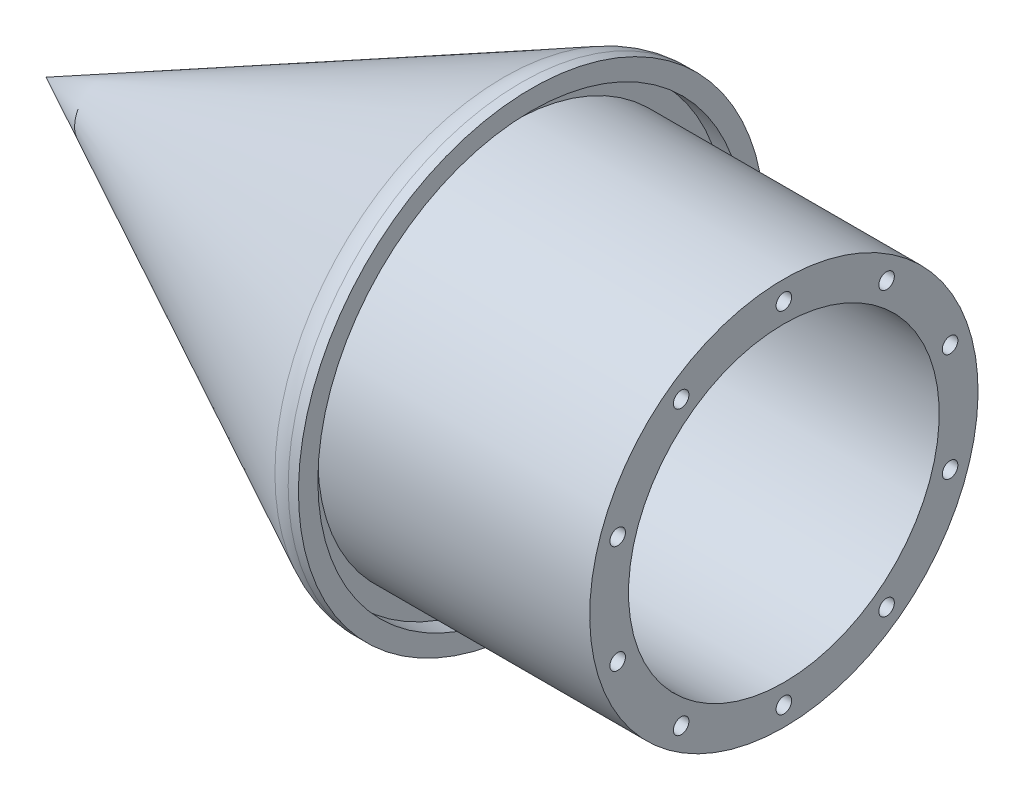
ISO-10303-21;
HEADER;
FILE_DESCRIPTION(('STEP AP214'),'2;1');
FILE_NAME('part.step','',(''),(''),'','','');
FILE_SCHEMA(('AUTOMOTIVE_DESIGN { 1 0 10303 214 1 1 1 1 }'));
ENDSEC;
DATA;
#1=APPLICATION_CONTEXT('core data for automotive mechanical design processes');
#2=APPLICATION_PROTOCOL_DEFINITION('international standard','automotive_design',2000,#1);
#3=PRODUCT_CONTEXT('',#1,'mechanical');
#4=PRODUCT('Part','Part','',(#3));
#5=PRODUCT_RELATED_PRODUCT_CATEGORY('part','',(#4));
#6=PRODUCT_DEFINITION_FORMATION('','',#4);
#7=PRODUCT_DEFINITION_CONTEXT('part definition',#1,'design');
#8=PRODUCT_DEFINITION('design','',#6,#7);
#9=PRODUCT_DEFINITION_SHAPE('','',#8);
#10=(LENGTH_UNIT() NAMED_UNIT(*) SI_UNIT(.MILLI.,.METRE.));
#11=(NAMED_UNIT(*) PLANE_ANGLE_UNIT() SI_UNIT($,.RADIAN.));
#12=(NAMED_UNIT(*) SI_UNIT($,.STERADIAN.) SOLID_ANGLE_UNIT());
#13=UNCERTAINTY_MEASURE_WITH_UNIT(LENGTH_MEASURE(1.E-05),#10,'distance_accuracy_value','');
#14=(GEOMETRIC_REPRESENTATION_CONTEXT(3) GLOBAL_UNCERTAINTY_ASSIGNED_CONTEXT((#13)) GLOBAL_UNIT_ASSIGNED_CONTEXT((#10,
#11,#12)) REPRESENTATION_CONTEXT('',''));
#15=CARTESIAN_POINT('',(0.,0.,0.));
#16=DIRECTION('',(0.,0.,1.));
#17=DIRECTION('',(1.,0.,0.));
#18=AXIS2_PLACEMENT_3D('',#15,#16,#17);
#19=CARTESIAN_POINT('',(-80.,0.,0.));
#20=DIRECTION('',(1.,0.,0.));
#21=DIRECTION('',(0.,1.,0.));
#22=AXIS2_PLACEMENT_3D('',#19,#20,#21);
#23=CONICAL_SURFACE('',#22,45.,0.463647609000806);
#24=CARTESIAN_POINT('',(-170.,0.,0.));
#25=VERTEX_POINT('',#24);
#26=VERTEX_LOOP('',#25);
#27=FACE_BOUND('',#26,.T.);
#28=CARTESIAN_POINT('',(-80.,0.,0.));
#29=DIRECTION('',(-1.,0.,0.));
#30=DIRECTION('',(0.,-1.,0.));
#31=AXIS2_PLACEMENT_3D('',#28,#29,#30);
#32=CIRCLE('',#31,45.);
#33=CARTESIAN_POINT('',(-80.,-45.,0.));
#34=VERTEX_POINT('',#33);
#35=EDGE_CURVE('E64',#34,#34,#32,.T.);
#36=ORIENTED_EDGE('',*,*,#35,.F.);
#37=EDGE_LOOP('',(#36));
#38=FACE_BOUND('',#37,.T.);
#39=ADVANCED_FACE('F44',(#27,#38),#23,.F.);
#40=CARTESIAN_POINT('',(-80.,2.22044604925032E-13,0.));
#41=DIRECTION('',(-1.,0.,0.));
#42=DIRECTION('',(0.,-1.,0.));
#43=AXIS2_PLACEMENT_3D('',#40,#41,#42);
#44=PLANE('',#43);
#45=ORIENTED_EDGE('',*,*,#35,.T.);
#46=EDGE_LOOP('',(#45));
#47=FACE_BOUND('',#46,.T.);
#48=CARTESIAN_POINT('',(-80.,0.,0.));
#49=DIRECTION('',(-1.,0.,0.));
#50=DIRECTION('',(0.,-1.,0.));
#51=AXIS2_PLACEMENT_3D('',#48,#49,#50);
#52=CIRCLE('',#51,40.);
#53=CARTESIAN_POINT('',(-80.,-40.,0.));
#54=VERTEX_POINT('',#53);
#55=EDGE_CURVE('E67',#54,#54,#52,.T.);
#56=ORIENTED_EDGE('',*,*,#55,.F.);
#57=EDGE_LOOP('',(#56));
#58=FACE_BOUND('',#57,.T.);
#59=ADVANCED_FACE('F61',(#47,#58),#44,.T.);
#60=CARTESIAN_POINT('',(-170.,0.,0.));
#61=DIRECTION('',(-1.,0.,0.));
#62=DIRECTION('',(0.,-1.,0.));
#63=AXIS2_PLACEMENT_3D('',#60,#61,#62);
#64=CYLINDRICAL_SURFACE('',#63,40.);
#65=ORIENTED_EDGE('',*,*,#55,.T.);
#66=EDGE_LOOP('',(#65));
#67=FACE_BOUND('',#66,.T.);
#68=CARTESIAN_POINT('',(0.,0.,0.));
#69=DIRECTION('',(-1.,0.,0.));
#70=DIRECTION('',(0.,-1.,0.));
#71=AXIS2_PLACEMENT_3D('',#68,#69,#70);
#72=CIRCLE('',#71,40.);
#73=CARTESIAN_POINT('',(0.,-40.,0.));
#74=VERTEX_POINT('',#73);
#75=EDGE_CURVE('E73',#74,#74,#72,.T.);
#76=ORIENTED_EDGE('',*,*,#75,.F.);
#77=EDGE_LOOP('',(#76));
#78=FACE_BOUND('',#77,.T.);
#79=ADVANCED_FACE('F193',(#67,#78),#64,.F.);
#80=CARTESIAN_POINT('',(0.,0.,0.));
#81=DIRECTION('',(1.,0.,0.));
#82=DIRECTION('',(0.,1.,0.));
#83=AXIS2_PLACEMENT_3D('',#80,#81,#82);
#84=PLANE('',#83);
#85=CARTESIAN_POINT('',(0.,45.,0.));
#86=DIRECTION('',(1.,0.,0.));
#87=DIRECTION('',(0.,1.,0.));
#88=AXIS2_PLACEMENT_3D('',#85,#86,#87);
#89=CIRCLE('',#88,2.);
#90=CARTESIAN_POINT('',(0.,47.,0.));
#91=VERTEX_POINT('',#90);
#92=EDGE_CURVE('E165',#91,#91,#89,.T.);
#93=ORIENTED_EDGE('',*,*,#92,.F.);
#94=EDGE_LOOP('',(#93));
#95=FACE_BOUND('',#94,.T.);
#96=CARTESIAN_POINT('',(0.,36.405764746873,26.4503363531608));
#97=DIRECTION('',(1.,0.,0.));
#98=DIRECTION('',(0.,1.,0.));
#99=AXIS2_PLACEMENT_3D('',#96,#97,#98);
#100=CIRCLE('',#99,2.);
#101=CARTESIAN_POINT('',(0.,38.405764746873,26.4503363531608));
#102=VERTEX_POINT('',#101);
#103=EDGE_CURVE('E105',#102,#102,#100,.T.);
#104=ORIENTED_EDGE('',*,*,#103,.F.);
#105=EDGE_LOOP('',(#104));
#106=FACE_BOUND('',#105,.T.);
#107=CARTESIAN_POINT('',(0.,13.9057647468731,42.7975432332818));
#108=DIRECTION('',(1.,0.,0.));
#109=DIRECTION('',(0.,1.,0.));
#110=AXIS2_PLACEMENT_3D('',#107,#108,#109);
#111=CIRCLE('',#110,2.);
#112=CARTESIAN_POINT('',(0.,15.9057647468731,42.7975432332818));
#113=VERTEX_POINT('',#112);
#114=EDGE_CURVE('E104',#113,#113,#111,.T.);
#115=ORIENTED_EDGE('',*,*,#114,.F.);
#116=EDGE_LOOP('',(#115));
#117=FACE_BOUND('',#116,.T.);
#118=CARTESIAN_POINT('',(0.,-13.9057647468722,42.797543233282));
#119=DIRECTION('',(1.,0.,0.));
#120=DIRECTION('',(0.,1.,0.));
#121=AXIS2_PLACEMENT_3D('',#118,#119,#120);
#122=CIRCLE('',#121,2.);
#123=CARTESIAN_POINT('',(0.,-11.9057647468722,42.797543233282));
#124=VERTEX_POINT('',#123);
#125=EDGE_CURVE('E113',#124,#124,#122,.T.);
#126=ORIENTED_EDGE('',*,*,#125,.F.);
#127=EDGE_LOOP('',(#126));
#128=FACE_BOUND('',#127,.T.);
#129=CARTESIAN_POINT('',(0.,-36.4057647468724,26.4503363531616));
#130=DIRECTION('',(1.,0.,0.));
#131=DIRECTION('',(0.,1.,0.));
#132=AXIS2_PLACEMENT_3D('',#129,#130,#131);
#133=CIRCLE('',#132,2.);
#134=CARTESIAN_POINT('',(0.,-34.4057647468724,26.4503363531616));
#135=VERTEX_POINT('',#134);
#136=EDGE_CURVE('E121',#135,#135,#133,.T.);
#137=ORIENTED_EDGE('',*,*,#136,.F.);
#138=EDGE_LOOP('',(#137));
#139=FACE_BOUND('',#138,.T.);
#140=CARTESIAN_POINT('',(0.,-45.,3.14233320495882E-13));
#141=DIRECTION('',(1.,0.,0.));
#142=DIRECTION('',(0.,1.,0.));
#143=AXIS2_PLACEMENT_3D('',#140,#141,#142);
#144=CIRCLE('',#143,2.);
#145=CARTESIAN_POINT('',(0.,-43.,3.14233320495882E-13));
#146=VERTEX_POINT('',#145);
#147=EDGE_CURVE('E129',#146,#146,#144,.T.);
#148=ORIENTED_EDGE('',*,*,#147,.F.);
#149=EDGE_LOOP('',(#148));
#150=FACE_BOUND('',#149,.T.);
#151=CARTESIAN_POINT('',(0.,-36.4057647468728,-26.4503363531611));
#152=DIRECTION('',(1.,0.,0.));
#153=DIRECTION('',(0.,1.,0.));
#154=AXIS2_PLACEMENT_3D('',#151,#152,#153);
#155=CIRCLE('',#154,2.);
#156=CARTESIAN_POINT('',(0.,-34.4057647468728,-26.4503363531611));
#157=VERTEX_POINT('',#156);
#158=EDGE_CURVE('E137',#157,#157,#155,.T.);
#159=ORIENTED_EDGE('',*,*,#158,.F.);
#160=EDGE_LOOP('',(#159));
#161=FACE_BOUND('',#160,.T.);
#162=CARTESIAN_POINT('',(0.,-13.9057647468728,-42.7975432332819));
#163=DIRECTION('',(1.,0.,0.));
#164=DIRECTION('',(0.,1.,0.));
#165=AXIS2_PLACEMENT_3D('',#162,#163,#164);
#166=CIRCLE('',#165,2.);
#167=CARTESIAN_POINT('',(0.,-11.9057647468728,-42.7975432332819));
#168=VERTEX_POINT('',#167);
#169=EDGE_CURVE('E145',#168,#168,#166,.T.);
#170=ORIENTED_EDGE('',*,*,#169,.F.);
#171=EDGE_LOOP('',(#170));
#172=FACE_BOUND('',#171,.T.);
#173=CARTESIAN_POINT('',(0.,13.9057647468725,-42.797543233282));
#174=DIRECTION('',(1.,0.,0.));
#175=DIRECTION('',(0.,1.,0.));
#176=AXIS2_PLACEMENT_3D('',#173,#174,#175);
#177=CIRCLE('',#176,2.);
#178=CARTESIAN_POINT('',(0.,15.9057647468725,-42.797543233282));
#179=VERTEX_POINT('',#178);
#180=EDGE_CURVE('E153',#179,#179,#177,.T.);
#181=ORIENTED_EDGE('',*,*,#180,.F.);
#182=EDGE_LOOP('',(#181));
#183=FACE_BOUND('',#182,.T.);
#184=CARTESIAN_POINT('',(0.,36.4057647468726,-26.4503363531613));
#185=DIRECTION('',(1.,0.,0.));
#186=DIRECTION('',(0.,1.,0.));
#187=AXIS2_PLACEMENT_3D('',#184,#185,#186);
#188=CIRCLE('',#187,2.);
#189=CARTESIAN_POINT('',(0.,38.4057647468726,-26.4503363531613));
#190=VERTEX_POINT('',#189);
#191=EDGE_CURVE('E161',#190,#190,#188,.T.);
#192=ORIENTED_EDGE('',*,*,#191,.F.);
#193=EDGE_LOOP('',(#192));
#194=FACE_BOUND('',#193,.T.);
#195=ORIENTED_EDGE('',*,*,#75,.T.);
#196=EDGE_LOOP('',(#195));
#197=FACE_BOUND('',#196,.T.);
#198=CARTESIAN_POINT('',(0.,0.,0.));
#199=DIRECTION('',(-1.,0.,0.));
#200=DIRECTION('',(0.,-1.,0.));
#201=AXIS2_PLACEMENT_3D('',#198,#199,#200);
#202=CIRCLE('',#201,50.);
#203=CARTESIAN_POINT('',(0.,-50.,0.));
#204=VERTEX_POINT('',#203);
#205=EDGE_CURVE('E79',#204,#204,#202,.T.);
#206=ORIENTED_EDGE('',*,*,#205,.F.);
#207=EDGE_LOOP('',(#206));
#208=FACE_BOUND('',#207,.T.);
#209=ADVANCED_FACE('F189',(#95,#106,#117,#128,#139,#150,#161,#172,#183,#194,#197,#208),#84,.T.);
#210=CARTESIAN_POINT('',(-170.,0.,0.));
#211=DIRECTION('',(-1.,0.,0.));
#212=DIRECTION('',(0.,-1.,0.));
#213=AXIS2_PLACEMENT_3D('',#210,#211,#212);
#214=CYLINDRICAL_SURFACE('',#213,50.);
#215=CARTESIAN_POINT('',(-70.,0.,0.));
#216=DIRECTION('',(-1.,0.,0.));
#217=DIRECTION('',(0.,-1.,0.));
#218=AXIS2_PLACEMENT_3D('',#215,#216,#217);
#219=CIRCLE('',#218,50.);
#220=CARTESIAN_POINT('',(-70.,-50.,0.));
#221=VERTEX_POINT('',#220);
#222=EDGE_CURVE('E83',#221,#221,#219,.T.);
#223=ORIENTED_EDGE('',*,*,#222,.F.);
#224=EDGE_LOOP('',(#223));
#225=FACE_BOUND('',#224,.T.);
#226=ORIENTED_EDGE('',*,*,#205,.T.);
#227=EDGE_LOOP('',(#226));
#228=FACE_BOUND('',#227,.T.);
#229=ADVANCED_FACE('F192',(#225,#228),#214,.T.);
#230=CARTESIAN_POINT('',(-70.,-1.94289029309402E-13,0.));
#231=DIRECTION('',(-1.,0.,0.));
#232=DIRECTION('',(0.,-1.,0.));
#233=AXIS2_PLACEMENT_3D('',#230,#231,#232);
#234=PLANE('',#233);
#235=CARTESIAN_POINT('',(-70.,0.,0.));
#236=DIRECTION('',(-1.,0.,0.));
#237=DIRECTION('',(0.,-1.,0.));
#238=AXIS2_PLACEMENT_3D('',#235,#236,#237);
#239=CIRCLE('',#238,55.);
#240=CARTESIAN_POINT('',(-70.,-55.,0.));
#241=VERTEX_POINT('',#240);
#242=EDGE_CURVE('E87',#241,#241,#239,.T.);
#243=ORIENTED_EDGE('',*,*,#242,.F.);
#244=EDGE_LOOP('',(#243));
#245=FACE_BOUND('',#244,.T.);
#246=ORIENTED_EDGE('',*,*,#222,.T.);
#247=EDGE_LOOP('',(#246));
#248=FACE_BOUND('',#247,.T.);
#249=ADVANCED_FACE('F218',(#245,#248),#234,.F.);
#250=CARTESIAN_POINT('',(-170.,0.,0.));
#251=DIRECTION('',(-1.,0.,0.));
#252=DIRECTION('',(0.,-1.,0.));
#253=AXIS2_PLACEMENT_3D('',#250,#251,#252);
#254=CYLINDRICAL_SURFACE('',#253,55.);
#255=CARTESIAN_POINT('',(-65.,0.,0.));
#256=DIRECTION('',(-1.,0.,0.));
#257=DIRECTION('',(0.,-1.,0.));
#258=AXIS2_PLACEMENT_3D('',#255,#256,#257);
#259=CIRCLE('',#258,55.);
#260=CARTESIAN_POINT('',(-65.,-55.,0.));
#261=VERTEX_POINT('',#260);
#262=EDGE_CURVE('E91',#261,#261,#259,.T.);
#263=ORIENTED_EDGE('',*,*,#262,.F.);
#264=EDGE_LOOP('',(#263));
#265=FACE_BOUND('',#264,.T.);
#266=ORIENTED_EDGE('',*,*,#242,.T.);
#267=EDGE_LOOP('',(#266));
#268=FACE_BOUND('',#267,.T.);
#269=ADVANCED_FACE('F224',(#265,#268),#254,.F.);
#270=CARTESIAN_POINT('',(-65.,0.,0.));
#271=DIRECTION('',(-1.,0.,0.));
#272=DIRECTION('',(0.,-1.,0.));
#273=AXIS2_PLACEMENT_3D('',#270,#271,#272);
#274=PLANE('',#273);
#275=CARTESIAN_POINT('',(-65.,0.,0.));
#276=DIRECTION('',(-1.,0.,0.));
#277=DIRECTION('',(0.,-1.,0.));
#278=AXIS2_PLACEMENT_3D('',#275,#276,#277);
#279=CIRCLE('',#278,60.);
#280=CARTESIAN_POINT('',(-65.,-60.,0.));
#281=VERTEX_POINT('',#280);
#282=EDGE_CURVE('E95',#281,#281,#279,.T.);
#283=ORIENTED_EDGE('',*,*,#282,.F.);
#284=EDGE_LOOP('',(#283));
#285=FACE_BOUND('',#284,.T.);
#286=ORIENTED_EDGE('',*,*,#262,.T.);
#287=EDGE_LOOP('',(#286));
#288=FACE_BOUND('',#287,.T.);
#289=ADVANCED_FACE('F257',(#285,#288),#274,.F.);
#290=CARTESIAN_POINT('',(-170.,0.,0.));
#291=DIRECTION('',(-1.,0.,0.));
#292=DIRECTION('',(0.,-1.,0.));
#293=AXIS2_PLACEMENT_3D('',#290,#291,#292);
#294=CYLINDRICAL_SURFACE('',#293,60.);
#295=CARTESIAN_POINT('',(-67.6393202250021,0.,0.));
#296=DIRECTION('',(1.,0.,0.));
#297=DIRECTION('',(0.,1.,0.));
#298=AXIS2_PLACEMENT_3D('',#295,#296,#297);
#299=CIRCLE('',#298,60.);
#300=CARTESIAN_POINT('',(-67.6393202250021,60.,0.));
#301=VERTEX_POINT('',#300);
#302=EDGE_CURVE('E11',#301,#301,#299,.T.);
#303=ORIENTED_EDGE('',*,*,#302,.T.);
#304=EDGE_LOOP('',(#303));
#305=FACE_BOUND('',#304,.T.);
#306=ORIENTED_EDGE('',*,*,#282,.T.);
#307=EDGE_LOOP('',(#306));
#308=FACE_BOUND('',#307,.T.);
#309=ADVANCED_FACE('F480',(#305,#308),#294,.T.);
#310=CARTESIAN_POINT('',(-70.,0.,0.));
#311=DIRECTION('',(1.,0.,0.));
#312=DIRECTION('',(0.,1.,0.));
#313=AXIS2_PLACEMENT_3D('',#310,#311,#312);
#314=CONICAL_SURFACE('',#313,60.,0.463647609000806);
#315=CARTESIAN_POINT('',(-72.1114561800017,0.,0.));
#316=DIRECTION('',(-1.,0.,0.));
#317=DIRECTION('',(0.,-1.,0.));
#318=AXIS2_PLACEMENT_3D('',#315,#316,#317);
#319=CIRCLE('',#318,58.9442719099992);
#320=CARTESIAN_POINT('',(-72.1114561800017,-58.9442719099992,0.));
#321=VERTEX_POINT('',#320);
#322=EDGE_CURVE('E53',#321,#321,#319,.T.);
#323=ORIENTED_EDGE('',*,*,#322,.T.);
#324=EDGE_LOOP('',(#323));
#325=FACE_BOUND('',#324,.T.);
#326=CARTESIAN_POINT('',(-190.,0.,0.));
#327=VERTEX_POINT('',#326);
#328=VERTEX_LOOP('',#327);
#329=FACE_BOUND('',#328,.T.);
#330=ADVANCED_FACE('F268',(#325,#329),#314,.T.);
#331=CARTESIAN_POINT('',(-20.,36.4057647468726,-26.4503363531613));
#332=DIRECTION('',(1.,0.,0.));
#333=DIRECTION('',(0.,1.,0.));
#334=AXIS2_PLACEMENT_3D('',#331,#332,#333);
#335=CYLINDRICAL_SURFACE('',#334,2.);
#336=CARTESIAN_POINT('',(-20.,36.4057647468726,-26.4503363531613));
#337=DIRECTION('',(1.,0.,0.));
#338=DIRECTION('',(0.,1.,0.));
#339=AXIS2_PLACEMENT_3D('',#336,#337,#338);
#340=CIRCLE('',#339,2.);
#341=CARTESIAN_POINT('',(-20.,38.4057647468726,-26.4503363531613));
#342=VERTEX_POINT('',#341);
#343=EDGE_CURVE('E157',#342,#342,#340,.T.);
#344=ORIENTED_EDGE('',*,*,#343,.F.);
#345=EDGE_LOOP('',(#344));
#346=FACE_BOUND('',#345,.T.);
#347=ORIENTED_EDGE('',*,*,#191,.T.);
#348=EDGE_LOOP('',(#347));
#349=FACE_BOUND('',#348,.T.);
#350=ADVANCED_FACE('F262',(#346,#349),#335,.F.);
#351=CARTESIAN_POINT('',(-20.,36.4057647468726,-26.4503363531613));
#352=DIRECTION('',(1.,0.,0.));
#353=DIRECTION('',(0.,1.,0.));
#354=AXIS2_PLACEMENT_3D('',#351,#352,#353);
#355=PLANE('',#354);
#356=ORIENTED_EDGE('',*,*,#343,.T.);
#357=EDGE_LOOP('',(#356));
#358=FACE_BOUND('',#357,.T.);
#359=ADVANCED_FACE('F267',(#358),#355,.T.);
#360=CARTESIAN_POINT('',(-20.,13.9057647468725,-42.797543233282));
#361=DIRECTION('',(1.,0.,0.));
#362=DIRECTION('',(0.,1.,0.));
#363=AXIS2_PLACEMENT_3D('',#360,#361,#362);
#364=CYLINDRICAL_SURFACE('',#363,2.);
#365=CARTESIAN_POINT('',(-20.,13.9057647468725,-42.797543233282));
#366=DIRECTION('',(1.,0.,0.));
#367=DIRECTION('',(0.,1.,0.));
#368=AXIS2_PLACEMENT_3D('',#365,#366,#367);
#369=CIRCLE('',#368,2.);
#370=CARTESIAN_POINT('',(-20.,15.9057647468725,-42.797543233282));
#371=VERTEX_POINT('',#370);
#372=EDGE_CURVE('E149',#371,#371,#369,.T.);
#373=ORIENTED_EDGE('',*,*,#372,.F.);
#374=EDGE_LOOP('',(#373));
#375=FACE_BOUND('',#374,.T.);
#376=ORIENTED_EDGE('',*,*,#180,.T.);
#377=EDGE_LOOP('',(#376));
#378=FACE_BOUND('',#377,.T.);
#379=ADVANCED_FACE('F281',(#375,#378),#364,.F.);
#380=CARTESIAN_POINT('',(-20.,13.9057647468725,-42.797543233282));
#381=DIRECTION('',(1.,0.,0.));
#382=DIRECTION('',(0.,1.,0.));
#383=AXIS2_PLACEMENT_3D('',#380,#381,#382);
#384=PLANE('',#383);
#385=ORIENTED_EDGE('',*,*,#372,.T.);
#386=EDGE_LOOP('',(#385));
#387=FACE_BOUND('',#386,.T.);
#388=ADVANCED_FACE('F292',(#387),#384,.T.);
#389=CARTESIAN_POINT('',(-20.,-13.9057647468728,-42.7975432332819));
#390=DIRECTION('',(1.,0.,0.));
#391=DIRECTION('',(0.,1.,0.));
#392=AXIS2_PLACEMENT_3D('',#389,#390,#391);
#393=CYLINDRICAL_SURFACE('',#392,2.);
#394=CARTESIAN_POINT('',(-20.,-13.9057647468728,-42.7975432332819));
#395=DIRECTION('',(1.,0.,0.));
#396=DIRECTION('',(0.,1.,0.));
#397=AXIS2_PLACEMENT_3D('',#394,#395,#396);
#398=CIRCLE('',#397,2.);
#399=CARTESIAN_POINT('',(-20.,-11.9057647468728,-42.7975432332819));
#400=VERTEX_POINT('',#399);
#401=EDGE_CURVE('E141',#400,#400,#398,.T.);
#402=ORIENTED_EDGE('',*,*,#401,.F.);
#403=EDGE_LOOP('',(#402));
#404=FACE_BOUND('',#403,.T.);
#405=ORIENTED_EDGE('',*,*,#169,.T.);
#406=EDGE_LOOP('',(#405));
#407=FACE_BOUND('',#406,.T.);
#408=ADVANCED_FACE('F303',(#404,#407),#393,.F.);
#409=CARTESIAN_POINT('',(-20.,-13.9057647468728,-42.7975432332819));
#410=DIRECTION('',(1.,0.,0.));
#411=DIRECTION('',(0.,1.,0.));
#412=AXIS2_PLACEMENT_3D('',#409,#410,#411);
#413=PLANE('',#412);
#414=ORIENTED_EDGE('',*,*,#401,.T.);
#415=EDGE_LOOP('',(#414));
#416=FACE_BOUND('',#415,.T.);
#417=ADVANCED_FACE('F314',(#416),#413,.T.);
#418=CARTESIAN_POINT('',(-20.,-36.4057647468728,-26.4503363531611));
#419=DIRECTION('',(1.,0.,0.));
#420=DIRECTION('',(0.,1.,0.));
#421=AXIS2_PLACEMENT_3D('',#418,#419,#420);
#422=CYLINDRICAL_SURFACE('',#421,2.);
#423=CARTESIAN_POINT('',(-20.,-36.4057647468728,-26.4503363531611));
#424=DIRECTION('',(1.,0.,0.));
#425=DIRECTION('',(0.,1.,0.));
#426=AXIS2_PLACEMENT_3D('',#423,#424,#425);
#427=CIRCLE('',#426,2.);
#428=CARTESIAN_POINT('',(-20.,-34.4057647468728,-26.4503363531611));
#429=VERTEX_POINT('',#428);
#430=EDGE_CURVE('E133',#429,#429,#427,.T.);
#431=ORIENTED_EDGE('',*,*,#430,.F.);
#432=EDGE_LOOP('',(#431));
#433=FACE_BOUND('',#432,.T.);
#434=ORIENTED_EDGE('',*,*,#158,.T.);
#435=EDGE_LOOP('',(#434));
#436=FACE_BOUND('',#435,.T.);
#437=ADVANCED_FACE('F325',(#433,#436),#422,.F.);
#438=CARTESIAN_POINT('',(-20.,-36.4057647468728,-26.4503363531611));
#439=DIRECTION('',(1.,0.,0.));
#440=DIRECTION('',(0.,1.,0.));
#441=AXIS2_PLACEMENT_3D('',#438,#439,#440);
#442=PLANE('',#441);
#443=ORIENTED_EDGE('',*,*,#430,.T.);
#444=EDGE_LOOP('',(#443));
#445=FACE_BOUND('',#444,.T.);
#446=ADVANCED_FACE('F336',(#445),#442,.T.);
#447=CARTESIAN_POINT('',(-20.,-45.,3.14233320495882E-13));
#448=DIRECTION('',(1.,0.,0.));
#449=DIRECTION('',(0.,1.,0.));
#450=AXIS2_PLACEMENT_3D('',#447,#448,#449);
#451=CYLINDRICAL_SURFACE('',#450,2.);
#452=CARTESIAN_POINT('',(-20.,-45.,3.14233320495882E-13));
#453=DIRECTION('',(1.,0.,0.));
#454=DIRECTION('',(0.,1.,0.));
#455=AXIS2_PLACEMENT_3D('',#452,#453,#454);
#456=CIRCLE('',#455,2.);
#457=CARTESIAN_POINT('',(-20.,-43.,3.14233320495882E-13));
#458=VERTEX_POINT('',#457);
#459=EDGE_CURVE('E125',#458,#458,#456,.T.);
#460=ORIENTED_EDGE('',*,*,#459,.F.);
#461=EDGE_LOOP('',(#460));
#462=FACE_BOUND('',#461,.T.);
#463=ORIENTED_EDGE('',*,*,#147,.T.);
#464=EDGE_LOOP('',(#463));
#465=FACE_BOUND('',#464,.T.);
#466=ADVANCED_FACE('F347',(#462,#465),#451,.F.);
#467=CARTESIAN_POINT('',(-20.,-45.,3.14233320495882E-13));
#468=DIRECTION('',(1.,0.,0.));
#469=DIRECTION('',(0.,1.,0.));
#470=AXIS2_PLACEMENT_3D('',#467,#468,#469);
#471=PLANE('',#470);
#472=ORIENTED_EDGE('',*,*,#459,.T.);
#473=EDGE_LOOP('',(#472));
#474=FACE_BOUND('',#473,.T.);
#475=ADVANCED_FACE('F358',(#474),#471,.T.);
#476=CARTESIAN_POINT('',(-20.,-36.4057647468724,26.4503363531616));
#477=DIRECTION('',(1.,0.,0.));
#478=DIRECTION('',(0.,1.,0.));
#479=AXIS2_PLACEMENT_3D('',#476,#477,#478);
#480=CYLINDRICAL_SURFACE('',#479,2.);
#481=CARTESIAN_POINT('',(-20.,-36.4057647468724,26.4503363531616));
#482=DIRECTION('',(1.,0.,0.));
#483=DIRECTION('',(0.,1.,0.));
#484=AXIS2_PLACEMENT_3D('',#481,#482,#483);
#485=CIRCLE('',#484,2.);
#486=CARTESIAN_POINT('',(-20.,-34.4057647468724,26.4503363531616));
#487=VERTEX_POINT('',#486);
#488=EDGE_CURVE('E117',#487,#487,#485,.T.);
#489=ORIENTED_EDGE('',*,*,#488,.F.);
#490=EDGE_LOOP('',(#489));
#491=FACE_BOUND('',#490,.T.);
#492=ORIENTED_EDGE('',*,*,#136,.T.);
#493=EDGE_LOOP('',(#492));
#494=FACE_BOUND('',#493,.T.);
#495=ADVANCED_FACE('F369',(#491,#494),#480,.F.);
#496=CARTESIAN_POINT('',(-20.,-36.4057647468724,26.4503363531616));
#497=DIRECTION('',(1.,0.,0.));
#498=DIRECTION('',(0.,1.,0.));
#499=AXIS2_PLACEMENT_3D('',#496,#497,#498);
#500=PLANE('',#499);
#501=ORIENTED_EDGE('',*,*,#488,.T.);
#502=EDGE_LOOP('',(#501));
#503=FACE_BOUND('',#502,.T.);
#504=ADVANCED_FACE('F380',(#503),#500,.T.);
#505=CARTESIAN_POINT('',(-20.,-13.9057647468722,42.797543233282));
#506=DIRECTION('',(1.,0.,0.));
#507=DIRECTION('',(0.,1.,0.));
#508=AXIS2_PLACEMENT_3D('',#505,#506,#507);
#509=CYLINDRICAL_SURFACE('',#508,2.);
#510=CARTESIAN_POINT('',(-20.,-13.9057647468722,42.797543233282));
#511=DIRECTION('',(1.,0.,0.));
#512=DIRECTION('',(0.,1.,0.));
#513=AXIS2_PLACEMENT_3D('',#510,#511,#512);
#514=CIRCLE('',#513,2.);
#515=CARTESIAN_POINT('',(-20.,-11.9057647468722,42.797543233282));
#516=VERTEX_POINT('',#515);
#517=EDGE_CURVE('E109',#516,#516,#514,.T.);
#518=ORIENTED_EDGE('',*,*,#517,.F.);
#519=EDGE_LOOP('',(#518));
#520=FACE_BOUND('',#519,.T.);
#521=ORIENTED_EDGE('',*,*,#125,.T.);
#522=EDGE_LOOP('',(#521));
#523=FACE_BOUND('',#522,.T.);
#524=ADVANCED_FACE('F391',(#520,#523),#509,.F.);
#525=CARTESIAN_POINT('',(-20.,-13.9057647468722,42.797543233282));
#526=DIRECTION('',(1.,0.,0.));
#527=DIRECTION('',(0.,1.,0.));
#528=AXIS2_PLACEMENT_3D('',#525,#526,#527);
#529=PLANE('',#528);
#530=ORIENTED_EDGE('',*,*,#517,.T.);
#531=EDGE_LOOP('',(#530));
#532=FACE_BOUND('',#531,.T.);
#533=ADVANCED_FACE('F402',(#532),#529,.T.);
#534=CARTESIAN_POINT('',(-20.,13.9057647468731,42.7975432332818));
#535=DIRECTION('',(1.,0.,0.));
#536=DIRECTION('',(0.,1.,0.));
#537=AXIS2_PLACEMENT_3D('',#534,#535,#536);
#538=CYLINDRICAL_SURFACE('',#537,2.);
#539=CARTESIAN_POINT('',(-20.,13.9057647468731,42.7975432332818));
#540=DIRECTION('',(1.,0.,0.));
#541=DIRECTION('',(0.,1.,0.));
#542=AXIS2_PLACEMENT_3D('',#539,#540,#541);
#543=CIRCLE('',#542,2.);
#544=CARTESIAN_POINT('',(-20.,15.9057647468731,42.7975432332818));
#545=VERTEX_POINT('',#544);
#546=EDGE_CURVE('E100',#545,#545,#543,.T.);
#547=ORIENTED_EDGE('',*,*,#546,.F.);
#548=EDGE_LOOP('',(#547));
#549=FACE_BOUND('',#548,.T.);
#550=ORIENTED_EDGE('',*,*,#114,.T.);
#551=EDGE_LOOP('',(#550));
#552=FACE_BOUND('',#551,.T.);
#553=ADVANCED_FACE('F413',(#549,#552),#538,.F.);
#554=CARTESIAN_POINT('',(-20.,13.9057647468731,42.7975432332818));
#555=DIRECTION('',(1.,0.,0.));
#556=DIRECTION('',(0.,1.,0.));
#557=AXIS2_PLACEMENT_3D('',#554,#555,#556);
#558=PLANE('',#557);
#559=ORIENTED_EDGE('',*,*,#546,.T.);
#560=EDGE_LOOP('',(#559));
#561=FACE_BOUND('',#560,.T.);
#562=ADVANCED_FACE('F424',(#561),#558,.T.);
#563=CARTESIAN_POINT('',(-20.,36.405764746873,26.4503363531608));
#564=DIRECTION('',(1.,0.,0.));
#565=DIRECTION('',(0.,1.,0.));
#566=AXIS2_PLACEMENT_3D('',#563,#564,#565);
#567=CYLINDRICAL_SURFACE('',#566,2.);
#568=CARTESIAN_POINT('',(-20.,36.405764746873,26.4503363531608));
#569=DIRECTION('',(1.,0.,0.));
#570=DIRECTION('',(0.,1.,0.));
#571=AXIS2_PLACEMENT_3D('',#568,#569,#570);
#572=CIRCLE('',#571,2.);
#573=CARTESIAN_POINT('',(-20.,38.405764746873,26.4503363531608));
#574=VERTEX_POINT('',#573);
#575=EDGE_CURVE('E166',#574,#574,#572,.T.);
#576=ORIENTED_EDGE('',*,*,#575,.F.);
#577=EDGE_LOOP('',(#576));
#578=FACE_BOUND('',#577,.T.);
#579=ORIENTED_EDGE('',*,*,#103,.T.);
#580=EDGE_LOOP('',(#579));
#581=FACE_BOUND('',#580,.T.);
#582=ADVANCED_FACE('F435',(#578,#581),#567,.F.);
#583=CARTESIAN_POINT('',(-20.,36.405764746873,26.4503363531608));
#584=DIRECTION('',(1.,0.,0.));
#585=DIRECTION('',(0.,1.,0.));
#586=AXIS2_PLACEMENT_3D('',#583,#584,#585);
#587=PLANE('',#586);
#588=ORIENTED_EDGE('',*,*,#575,.T.);
#589=EDGE_LOOP('',(#588));
#590=FACE_BOUND('',#589,.T.);
#591=ADVANCED_FACE('F185',(#590),#587,.T.);
#592=CARTESIAN_POINT('',(-20.,45.,0.));
#593=DIRECTION('',(1.,0.,0.));
#594=DIRECTION('',(0.,1.,0.));
#595=AXIS2_PLACEMENT_3D('',#592,#593,#594);
#596=CYLINDRICAL_SURFACE('',#595,2.);
#597=CARTESIAN_POINT('',(-20.,45.,0.));
#598=DIRECTION('',(1.,0.,0.));
#599=DIRECTION('',(0.,1.,0.));
#600=AXIS2_PLACEMENT_3D('',#597,#598,#599);
#601=CIRCLE('',#600,2.);
#602=CARTESIAN_POINT('',(-20.,47.,0.));
#603=VERTEX_POINT('',#602);
#604=EDGE_CURVE('E99',#603,#603,#601,.T.);
#605=ORIENTED_EDGE('',*,*,#604,.F.);
#606=EDGE_LOOP('',(#605));
#607=FACE_BOUND('',#606,.T.);
#608=ORIENTED_EDGE('',*,*,#92,.T.);
#609=EDGE_LOOP('',(#608));
#610=FACE_BOUND('',#609,.T.);
#611=ADVANCED_FACE('F182',(#607,#610),#596,.F.);
#612=CARTESIAN_POINT('',(-20.,45.,0.));
#613=DIRECTION('',(1.,0.,0.));
#614=DIRECTION('',(0.,1.,0.));
#615=AXIS2_PLACEMENT_3D('',#612,#613,#614);
#616=PLANE('',#615);
#617=ORIENTED_EDGE('',*,*,#604,.T.);
#618=EDGE_LOOP('',(#617));
#619=FACE_BOUND('',#618,.T.);
#620=ADVANCED_FACE('F180',(#619),#616,.T.);
#621=CARTESIAN_POINT('',(-67.6393202250021,0.,0.));
#622=DIRECTION('',(1.,0.,0.));
#623=DIRECTION('',(0.,1.,0.));
#624=AXIS2_PLACEMENT_3D('',#621,#622,#623);
#625=TOROIDAL_SURFACE('',#624,50.,10.);
#626=ORIENTED_EDGE('',*,*,#302,.F.);
#627=EDGE_LOOP('',(#626));
#628=FACE_BOUND('',#627,.T.);
#629=ORIENTED_EDGE('',*,*,#322,.F.);
#630=EDGE_LOOP('',(#629));
#631=FACE_BOUND('',#630,.T.);
#632=ADVANCED_FACE('F46',(#628,#631),#625,.T.);
#633=CLOSED_SHELL('',(#39,#59,#79,#209,#229,#249,#269,#289,#309,#330,#350,#359,#379,#388,#408,
#417,#437,#446,#466,#475,#495,#504,#524,#533,#553,#562,#582,#591,#611,#620,#632));
#634=MANIFOLD_SOLID_BREP('B2',#633);
#635=ADVANCED_BREP_SHAPE_REPRESENTATION('',(#18,#634),#14);
#636=SHAPE_DEFINITION_REPRESENTATION(#9,#635);
ENDSEC;
END-ISO-10303-21;
